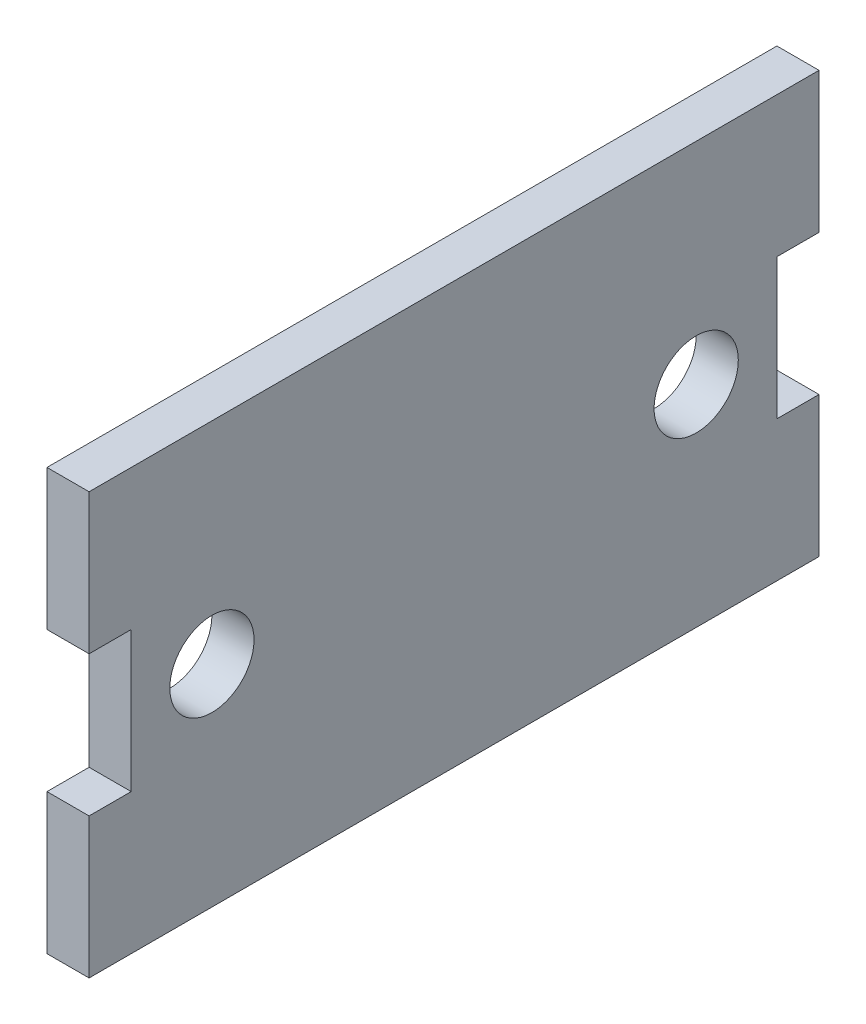
ISO-10303-21;
HEADER;
FILE_DESCRIPTION(('STEP AP214'),'2;1');
FILE_NAME('part.step','',(''),(''),'','','');
FILE_SCHEMA(('AUTOMOTIVE_DESIGN { 1 0 10303 214 1 1 1 1 }'));
ENDSEC;
DATA;
#1=APPLICATION_CONTEXT('core data for automotive mechanical design processes');
#2=APPLICATION_PROTOCOL_DEFINITION('international standard','automotive_design',2000,#1);
#3=PRODUCT_CONTEXT('',#1,'mechanical');
#4=PRODUCT('Part','Part','',(#3));
#5=PRODUCT_RELATED_PRODUCT_CATEGORY('part','',(#4));
#6=PRODUCT_DEFINITION_FORMATION('','',#4);
#7=PRODUCT_DEFINITION_CONTEXT('part definition',#1,'design');
#8=PRODUCT_DEFINITION('design','',#6,#7);
#9=PRODUCT_DEFINITION_SHAPE('','',#8);
#10=(LENGTH_UNIT() NAMED_UNIT(*) SI_UNIT(.MILLI.,.METRE.));
#11=(NAMED_UNIT(*) PLANE_ANGLE_UNIT() SI_UNIT($,.RADIAN.));
#12=(NAMED_UNIT(*) SI_UNIT($,.STERADIAN.) SOLID_ANGLE_UNIT());
#13=UNCERTAINTY_MEASURE_WITH_UNIT(LENGTH_MEASURE(1.E-05),#10,'distance_accuracy_value','');
#14=(GEOMETRIC_REPRESENTATION_CONTEXT(3) GLOBAL_UNCERTAINTY_ASSIGNED_CONTEXT((#13)) GLOBAL_UNIT_ASSIGNED_CONTEXT((#10,
#11,#12)) REPRESENTATION_CONTEXT('',''));
#15=CARTESIAN_POINT('',(0.,0.,0.));
#16=DIRECTION('',(0.,0.,1.));
#17=DIRECTION('',(1.,0.,0.));
#18=AXIS2_PLACEMENT_3D('',#15,#16,#17);
#19=CARTESIAN_POINT('',(1.5,5.,0.));
#20=DIRECTION('',(0.,0.,1.));
#21=DIRECTION('',(1.,0.,0.));
#22=AXIS2_PLACEMENT_3D('',#19,#20,#21);
#23=PLANE('',#22);
#24=DIRECTION('',(0.,1.,0.));
#25=VECTOR('',#24,1.);
#26=CARTESIAN_POINT('',(0.,5.,0.));
#27=LINE('',#26,#25);
#28=CARTESIAN_POINT('',(0.,0.,0.));
#29=VERTEX_POINT('',#28);
#30=CARTESIAN_POINT('',(0.,5.,0.));
#31=VERTEX_POINT('',#30);
#32=EDGE_CURVE('E163',#29,#31,#27,.T.);
#33=ORIENTED_EDGE('',*,*,#32,.T.);
#34=DIRECTION('',(-1.,0.,0.));
#35=VECTOR('',#34,1.);
#36=CARTESIAN_POINT('',(1.5,5.,0.));
#37=LINE('',#36,#35);
#38=CARTESIAN_POINT('',(1.5,5.,0.));
#39=VERTEX_POINT('',#38);
#40=EDGE_CURVE('E11',#39,#31,#37,.T.);
#41=ORIENTED_EDGE('',*,*,#40,.F.);
#42=DIRECTION('',(0.,1.,0.));
#43=VECTOR('',#42,1.);
#44=CARTESIAN_POINT('',(1.5,5.,0.));
#45=LINE('',#44,#43);
#46=CARTESIAN_POINT('',(1.5,0.,0.));
#47=VERTEX_POINT('',#46);
#48=EDGE_CURVE('E186',#47,#39,#45,.T.);
#49=ORIENTED_EDGE('',*,*,#48,.F.);
#50=DIRECTION('',(-1.,0.,0.));
#51=VECTOR('',#50,1.);
#52=CARTESIAN_POINT('',(1.5,0.,0.));
#53=LINE('',#52,#51);
#54=EDGE_CURVE('E159',#47,#29,#53,.T.);
#55=ORIENTED_EDGE('',*,*,#54,.T.);
#56=EDGE_LOOP('',(#33,#41,#49,#55));
#57=FACE_BOUND('',#56,.T.);
#58=ADVANCED_FACE('F43',(#57),#23,.F.);
#59=CARTESIAN_POINT('',(1.5,5.,1.5));
#60=DIRECTION('',(0.,-1.,0.));
#61=DIRECTION('',(0.,0.,-1.));
#62=AXIS2_PLACEMENT_3D('',#59,#60,#61);
#63=PLANE('',#62);
#64=DIRECTION('',(0.,0.,1.));
#65=VECTOR('',#64,1.);
#66=CARTESIAN_POINT('',(0.,5.,1.5));
#67=LINE('',#66,#65);
#68=CARTESIAN_POINT('',(0.,5.,1.5));
#69=VERTEX_POINT('',#68);
#70=EDGE_CURVE('E166',#31,#69,#67,.T.);
#71=ORIENTED_EDGE('',*,*,#70,.T.);
#72=DIRECTION('',(-1.,0.,0.));
#73=VECTOR('',#72,1.);
#74=CARTESIAN_POINT('',(1.5,5.,1.5));
#75=LINE('',#74,#73);
#76=CARTESIAN_POINT('',(1.5,5.,1.5));
#77=VERTEX_POINT('',#76);
#78=EDGE_CURVE('E51',#77,#69,#75,.T.);
#79=ORIENTED_EDGE('',*,*,#78,.F.);
#80=DIRECTION('',(0.,0.,1.));
#81=VECTOR('',#80,1.);
#82=CARTESIAN_POINT('',(1.5,5.,1.5));
#83=LINE('',#82,#81);
#84=EDGE_CURVE('E114',#39,#77,#83,.T.);
#85=ORIENTED_EDGE('',*,*,#84,.F.);
#86=ORIENTED_EDGE('',*,*,#40,.T.);
#87=EDGE_LOOP('',(#71,#79,#85,#86));
#88=FACE_BOUND('',#87,.T.);
#89=ADVANCED_FACE('F265',(#88),#63,.F.);
#90=CARTESIAN_POINT('',(1.5,10.,1.5));
#91=DIRECTION('',(0.,0.,1.));
#92=DIRECTION('',(0.,-1.,0.));
#93=AXIS2_PLACEMENT_3D('',#90,#91,#92);
#94=PLANE('',#93);
#95=DIRECTION('',(0.,1.,0.));
#96=VECTOR('',#95,1.);
#97=CARTESIAN_POINT('',(0.,10.,1.5));
#98=LINE('',#97,#96);
#99=CARTESIAN_POINT('',(0.,10.,1.5));
#100=VERTEX_POINT('',#99);
#101=EDGE_CURVE('E169',#69,#100,#98,.T.);
#102=ORIENTED_EDGE('',*,*,#101,.T.);
#103=DIRECTION('',(-1.,0.,0.));
#104=VECTOR('',#103,1.);
#105=CARTESIAN_POINT('',(1.5,10.,1.5));
#106=LINE('',#105,#104);
#107=CARTESIAN_POINT('',(1.5,10.,1.5));
#108=VERTEX_POINT('',#107);
#109=EDGE_CURVE('E205',#108,#100,#106,.T.);
#110=ORIENTED_EDGE('',*,*,#109,.F.);
#111=DIRECTION('',(0.,1.,0.));
#112=VECTOR('',#111,1.);
#113=CARTESIAN_POINT('',(1.5,10.,1.5));
#114=LINE('',#113,#112);
#115=EDGE_CURVE('E213',#77,#108,#114,.T.);
#116=ORIENTED_EDGE('',*,*,#115,.F.);
#117=ORIENTED_EDGE('',*,*,#78,.T.);
#118=EDGE_LOOP('',(#102,#110,#116,#117));
#119=FACE_BOUND('',#118,.T.);
#120=ADVANCED_FACE('F211',(#119),#94,.F.);
#121=CARTESIAN_POINT('',(1.5,10.,0.));
#122=DIRECTION('',(0.,1.,0.));
#123=DIRECTION('',(0.,0.,1.));
#124=AXIS2_PLACEMENT_3D('',#121,#122,#123);
#125=PLANE('',#124);
#126=DIRECTION('',(0.,0.,-1.));
#127=VECTOR('',#126,1.);
#128=CARTESIAN_POINT('',(0.,10.,0.));
#129=LINE('',#128,#127);
#130=CARTESIAN_POINT('',(0.,10.,0.));
#131=VERTEX_POINT('',#130);
#132=EDGE_CURVE('E171',#100,#131,#129,.T.);
#133=ORIENTED_EDGE('',*,*,#132,.T.);
#134=DIRECTION('',(-1.,0.,0.));
#135=VECTOR('',#134,1.);
#136=CARTESIAN_POINT('',(1.5,10.,0.));
#137=LINE('',#136,#135);
#138=CARTESIAN_POINT('',(1.5,10.,0.));
#139=VERTEX_POINT('',#138);
#140=EDGE_CURVE('E202',#139,#131,#137,.T.);
#141=ORIENTED_EDGE('',*,*,#140,.F.);
#142=DIRECTION('',(0.,0.,-1.));
#143=VECTOR('',#142,1.);
#144=CARTESIAN_POINT('',(1.5,10.,0.));
#145=LINE('',#144,#143);
#146=EDGE_CURVE('E231',#108,#139,#145,.T.);
#147=ORIENTED_EDGE('',*,*,#146,.F.);
#148=ORIENTED_EDGE('',*,*,#109,.T.);
#149=EDGE_LOOP('',(#133,#141,#147,#148));
#150=FACE_BOUND('',#149,.T.);
#151=ADVANCED_FACE('F222',(#150),#125,.F.);
#152=CARTESIAN_POINT('',(1.5,15.,0.));
#153=DIRECTION('',(0.,0.,1.));
#154=DIRECTION('',(0.,-1.,0.));
#155=AXIS2_PLACEMENT_3D('',#152,#153,#154);
#156=PLANE('',#155);
#157=DIRECTION('',(0.,1.,0.));
#158=VECTOR('',#157,1.);
#159=CARTESIAN_POINT('',(0.,15.,0.));
#160=LINE('',#159,#158);
#161=CARTESIAN_POINT('',(0.,15.,0.));
#162=VERTEX_POINT('',#161);
#163=EDGE_CURVE('E173',#131,#162,#160,.T.);
#164=ORIENTED_EDGE('',*,*,#163,.T.);
#165=DIRECTION('',(-1.,0.,0.));
#166=VECTOR('',#165,1.);
#167=CARTESIAN_POINT('',(1.5,15.,0.));
#168=LINE('',#167,#166);
#169=CARTESIAN_POINT('',(1.5,15.,0.));
#170=VERTEX_POINT('',#169);
#171=EDGE_CURVE('E199',#170,#162,#168,.T.);
#172=ORIENTED_EDGE('',*,*,#171,.F.);
#173=DIRECTION('',(0.,1.,0.));
#174=VECTOR('',#173,1.);
#175=CARTESIAN_POINT('',(1.5,15.,0.));
#176=LINE('',#175,#174);
#177=EDGE_CURVE('E228',#139,#170,#176,.T.);
#178=ORIENTED_EDGE('',*,*,#177,.F.);
#179=ORIENTED_EDGE('',*,*,#140,.T.);
#180=EDGE_LOOP('',(#164,#172,#178,#179));
#181=FACE_BOUND('',#180,.T.);
#182=ADVANCED_FACE('F226',(#181),#156,.F.);
#183=CARTESIAN_POINT('',(1.5,15.,26.));
#184=DIRECTION('',(0.,-1.,0.));
#185=DIRECTION('',(0.,0.,-1.));
#186=AXIS2_PLACEMENT_3D('',#183,#184,#185);
#187=PLANE('',#186);
#188=DIRECTION('',(0.,0.,1.));
#189=VECTOR('',#188,1.);
#190=CARTESIAN_POINT('',(0.,15.,26.));
#191=LINE('',#190,#189);
#192=CARTESIAN_POINT('',(0.,15.,26.));
#193=VERTEX_POINT('',#192);
#194=EDGE_CURVE('E175',#162,#193,#191,.T.);
#195=ORIENTED_EDGE('',*,*,#194,.T.);
#196=DIRECTION('',(-1.,0.,0.));
#197=VECTOR('',#196,1.);
#198=CARTESIAN_POINT('',(1.5,15.,26.));
#199=LINE('',#198,#197);
#200=CARTESIAN_POINT('',(1.5,15.,26.));
#201=VERTEX_POINT('',#200);
#202=EDGE_CURVE('E196',#201,#193,#199,.T.);
#203=ORIENTED_EDGE('',*,*,#202,.F.);
#204=DIRECTION('',(0.,0.,1.));
#205=VECTOR('',#204,1.);
#206=CARTESIAN_POINT('',(1.5,15.,26.));
#207=LINE('',#206,#205);
#208=EDGE_CURVE('E230',#170,#201,#207,.T.);
#209=ORIENTED_EDGE('',*,*,#208,.F.);
#210=ORIENTED_EDGE('',*,*,#171,.T.);
#211=EDGE_LOOP('',(#195,#203,#209,#210));
#212=FACE_BOUND('',#211,.T.);
#213=ADVANCED_FACE('F278',(#212),#187,.F.);
#214=CARTESIAN_POINT('',(1.5,10.,26.));
#215=DIRECTION('',(0.,0.,-1.));
#216=DIRECTION('',(-1.,0.,0.));
#217=AXIS2_PLACEMENT_3D('',#214,#215,#216);
#218=PLANE('',#217);
#219=DIRECTION('',(0.,-1.,0.));
#220=VECTOR('',#219,1.);
#221=CARTESIAN_POINT('',(0.,10.,26.));
#222=LINE('',#221,#220);
#223=CARTESIAN_POINT('',(0.,10.,26.));
#224=VERTEX_POINT('',#223);
#225=EDGE_CURVE('E177',#193,#224,#222,.T.);
#226=ORIENTED_EDGE('',*,*,#225,.T.);
#227=DIRECTION('',(-1.,0.,0.));
#228=VECTOR('',#227,1.);
#229=CARTESIAN_POINT('',(1.5,10.,26.));
#230=LINE('',#229,#228);
#231=CARTESIAN_POINT('',(1.5,10.,26.));
#232=VERTEX_POINT('',#231);
#233=EDGE_CURVE('E193',#232,#224,#230,.T.);
#234=ORIENTED_EDGE('',*,*,#233,.F.);
#235=DIRECTION('',(0.,-1.,0.));
#236=VECTOR('',#235,1.);
#237=CARTESIAN_POINT('',(1.5,10.,26.));
#238=LINE('',#237,#236);
#239=EDGE_CURVE('E233',#201,#232,#238,.T.);
#240=ORIENTED_EDGE('',*,*,#239,.F.);
#241=ORIENTED_EDGE('',*,*,#202,.T.);
#242=EDGE_LOOP('',(#226,#234,#240,#241));
#243=FACE_BOUND('',#242,.T.);
#244=ADVANCED_FACE('F281',(#243),#218,.F.);
#245=CARTESIAN_POINT('',(1.5,10.,24.5));
#246=DIRECTION('',(0.,1.,0.));
#247=DIRECTION('',(0.,0.,1.));
#248=AXIS2_PLACEMENT_3D('',#245,#246,#247);
#249=PLANE('',#248);
#250=DIRECTION('',(0.,0.,-1.));
#251=VECTOR('',#250,1.);
#252=CARTESIAN_POINT('',(0.,10.,24.5));
#253=LINE('',#252,#251);
#254=CARTESIAN_POINT('',(0.,10.,24.5));
#255=VERTEX_POINT('',#254);
#256=EDGE_CURVE('E179',#224,#255,#253,.T.);
#257=ORIENTED_EDGE('',*,*,#256,.T.);
#258=DIRECTION('',(-1.,0.,0.));
#259=VECTOR('',#258,1.);
#260=CARTESIAN_POINT('',(1.5,10.,24.5));
#261=LINE('',#260,#259);
#262=CARTESIAN_POINT('',(1.5,10.,24.5));
#263=VERTEX_POINT('',#262);
#264=EDGE_CURVE('E190',#263,#255,#261,.T.);
#265=ORIENTED_EDGE('',*,*,#264,.F.);
#266=DIRECTION('',(0.,0.,-1.));
#267=VECTOR('',#266,1.);
#268=CARTESIAN_POINT('',(1.5,10.,24.5));
#269=LINE('',#268,#267);
#270=EDGE_CURVE('E239',#232,#263,#269,.T.);
#271=ORIENTED_EDGE('',*,*,#270,.F.);
#272=ORIENTED_EDGE('',*,*,#233,.T.);
#273=EDGE_LOOP('',(#257,#265,#271,#272));
#274=FACE_BOUND('',#273,.T.);
#275=ADVANCED_FACE('F245',(#274),#249,.F.);
#276=CARTESIAN_POINT('',(1.5,5.,24.5));
#277=DIRECTION('',(0.,0.,-1.));
#278=DIRECTION('',(-1.,0.,0.));
#279=AXIS2_PLACEMENT_3D('',#276,#277,#278);
#280=PLANE('',#279);
#281=DIRECTION('',(0.,-1.,0.));
#282=VECTOR('',#281,1.);
#283=CARTESIAN_POINT('',(0.,5.,24.5));
#284=LINE('',#283,#282);
#285=CARTESIAN_POINT('',(0.,5.,24.5));
#286=VERTEX_POINT('',#285);
#287=EDGE_CURVE('E181',#255,#286,#284,.T.);
#288=ORIENTED_EDGE('',*,*,#287,.T.);
#289=DIRECTION('',(-1.,0.,0.));
#290=VECTOR('',#289,1.);
#291=CARTESIAN_POINT('',(1.5,5.,24.5));
#292=LINE('',#291,#290);
#293=CARTESIAN_POINT('',(1.5,5.,24.5));
#294=VERTEX_POINT('',#293);
#295=EDGE_CURVE('E154',#294,#286,#292,.T.);
#296=ORIENTED_EDGE('',*,*,#295,.F.);
#297=DIRECTION('',(0.,-1.,0.));
#298=VECTOR('',#297,1.);
#299=CARTESIAN_POINT('',(1.5,5.,24.5));
#300=LINE('',#299,#298);
#301=EDGE_CURVE('E145',#263,#294,#300,.T.);
#302=ORIENTED_EDGE('',*,*,#301,.F.);
#303=ORIENTED_EDGE('',*,*,#264,.T.);
#304=EDGE_LOOP('',(#288,#296,#302,#303));
#305=FACE_BOUND('',#304,.T.);
#306=ADVANCED_FACE('F249',(#305),#280,.F.);
#307=CARTESIAN_POINT('',(1.5,5.,26.));
#308=DIRECTION('',(0.,-1.,0.));
#309=DIRECTION('',(0.,0.,-1.));
#310=AXIS2_PLACEMENT_3D('',#307,#308,#309);
#311=PLANE('',#310);
#312=DIRECTION('',(0.,0.,1.));
#313=VECTOR('',#312,1.);
#314=CARTESIAN_POINT('',(0.,5.,26.));
#315=LINE('',#314,#313);
#316=CARTESIAN_POINT('',(0.,5.,26.));
#317=VERTEX_POINT('',#316);
#318=EDGE_CURVE('E153',#286,#317,#315,.T.);
#319=ORIENTED_EDGE('',*,*,#318,.T.);
#320=DIRECTION('',(-1.,0.,0.));
#321=VECTOR('',#320,1.);
#322=CARTESIAN_POINT('',(1.5,5.,26.));
#323=LINE('',#322,#321);
#324=CARTESIAN_POINT('',(1.5,5.,26.));
#325=VERTEX_POINT('',#324);
#326=EDGE_CURVE('E150',#325,#317,#323,.T.);
#327=ORIENTED_EDGE('',*,*,#326,.F.);
#328=DIRECTION('',(0.,0.,1.));
#329=VECTOR('',#328,1.);
#330=CARTESIAN_POINT('',(1.5,5.,26.));
#331=LINE('',#330,#329);
#332=EDGE_CURVE('E139',#294,#325,#331,.T.);
#333=ORIENTED_EDGE('',*,*,#332,.F.);
#334=ORIENTED_EDGE('',*,*,#295,.T.);
#335=EDGE_LOOP('',(#319,#327,#333,#334));
#336=FACE_BOUND('',#335,.T.);
#337=ADVANCED_FACE('F151',(#336),#311,.F.);
#338=CARTESIAN_POINT('',(1.5,0.,26.));
#339=DIRECTION('',(0.,0.,-1.));
#340=DIRECTION('',(-1.,0.,0.));
#341=AXIS2_PLACEMENT_3D('',#338,#339,#340);
#342=PLANE('',#341);
#343=DIRECTION('',(0.,-1.,0.));
#344=VECTOR('',#343,1.);
#345=CARTESIAN_POINT('',(0.,0.,26.));
#346=LINE('',#345,#344);
#347=CARTESIAN_POINT('',(0.,0.,26.));
#348=VERTEX_POINT('',#347);
#349=EDGE_CURVE('E100',#317,#348,#346,.T.);
#350=ORIENTED_EDGE('',*,*,#349,.T.);
#351=DIRECTION('',(-1.,0.,0.));
#352=VECTOR('',#351,1.);
#353=CARTESIAN_POINT('',(1.5,0.,26.));
#354=LINE('',#353,#352);
#355=CARTESIAN_POINT('',(1.5,0.,26.));
#356=VERTEX_POINT('',#355);
#357=EDGE_CURVE('E155',#356,#348,#354,.T.);
#358=ORIENTED_EDGE('',*,*,#357,.F.);
#359=DIRECTION('',(0.,-1.,0.));
#360=VECTOR('',#359,1.);
#361=CARTESIAN_POINT('',(1.5,0.,26.));
#362=LINE('',#361,#360);
#363=EDGE_CURVE('E143',#325,#356,#362,.T.);
#364=ORIENTED_EDGE('',*,*,#363,.F.);
#365=ORIENTED_EDGE('',*,*,#326,.T.);
#366=EDGE_LOOP('',(#350,#358,#364,#365));
#367=FACE_BOUND('',#366,.T.);
#368=ADVANCED_FACE('F157',(#367),#342,.F.);
#369=CARTESIAN_POINT('',(1.5,0.,0.));
#370=DIRECTION('',(0.,1.,0.));
#371=DIRECTION('',(0.,0.,1.));
#372=AXIS2_PLACEMENT_3D('',#369,#370,#371);
#373=PLANE('',#372);
#374=DIRECTION('',(0.,0.,-1.));
#375=VECTOR('',#374,1.);
#376=CARTESIAN_POINT('',(0.,0.,0.));
#377=LINE('',#376,#375);
#378=EDGE_CURVE('E106',#348,#29,#377,.T.);
#379=ORIENTED_EDGE('',*,*,#378,.T.);
#380=ORIENTED_EDGE('',*,*,#54,.F.);
#381=DIRECTION('',(0.,0.,-1.));
#382=VECTOR('',#381,1.);
#383=CARTESIAN_POINT('',(1.5,0.,0.));
#384=LINE('',#383,#382);
#385=EDGE_CURVE('E59',#356,#47,#384,.T.);
#386=ORIENTED_EDGE('',*,*,#385,.F.);
#387=ORIENTED_EDGE('',*,*,#357,.T.);
#388=EDGE_LOOP('',(#379,#380,#386,#387));
#389=FACE_BOUND('',#388,.T.);
#390=ADVANCED_FACE('F253',(#389),#373,.F.);
#391=CARTESIAN_POINT('',(1.5,0.,0.));
#392=DIRECTION('',(-1.,0.,0.));
#393=DIRECTION('',(0.,0.,1.));
#394=AXIS2_PLACEMENT_3D('',#391,#392,#393);
#395=PLANE('',#394);
#396=CARTESIAN_POINT('',(1.5,7.5,21.625));
#397=DIRECTION('',(1.,0.,0.));
#398=DIRECTION('',(0.,0.,-1.));
#399=AXIS2_PLACEMENT_3D('',#396,#397,#398);
#400=CIRCLE('',#399,1.5);
#401=CARTESIAN_POINT('',(1.5,7.5,20.125));
#402=VERTEX_POINT('',#401);
#403=EDGE_CURVE('E452',#402,#402,#400,.T.);
#404=ORIENTED_EDGE('',*,*,#403,.F.);
#405=EDGE_LOOP('',(#404));
#406=FACE_BOUND('',#405,.T.);
#407=CARTESIAN_POINT('',(1.5,7.5,4.375));
#408=DIRECTION('',(1.,0.,0.));
#409=DIRECTION('',(0.,0.,-1.));
#410=AXIS2_PLACEMENT_3D('',#407,#408,#409);
#411=CIRCLE('',#410,1.5);
#412=CARTESIAN_POINT('',(1.5,7.5,2.875));
#413=VERTEX_POINT('',#412);
#414=EDGE_CURVE('E453',#413,#413,#411,.T.);
#415=ORIENTED_EDGE('',*,*,#414,.F.);
#416=EDGE_LOOP('',(#415));
#417=FACE_BOUND('',#416,.T.);
#418=ORIENTED_EDGE('',*,*,#48,.T.);
#419=ORIENTED_EDGE('',*,*,#84,.T.);
#420=ORIENTED_EDGE('',*,*,#115,.T.);
#421=ORIENTED_EDGE('',*,*,#146,.T.);
#422=ORIENTED_EDGE('',*,*,#177,.T.);
#423=ORIENTED_EDGE('',*,*,#208,.T.);
#424=ORIENTED_EDGE('',*,*,#239,.T.);
#425=ORIENTED_EDGE('',*,*,#270,.T.);
#426=ORIENTED_EDGE('',*,*,#301,.T.);
#427=ORIENTED_EDGE('',*,*,#332,.T.);
#428=ORIENTED_EDGE('',*,*,#363,.T.);
#429=ORIENTED_EDGE('',*,*,#385,.T.);
#430=EDGE_LOOP('',(#418,#419,#420,#421,#422,#423,#424,#425,#426,#427,#428,#429));
#431=FACE_BOUND('',#430,.T.);
#432=ADVANCED_FACE('F141',(#406,#417,#431),#395,.F.);
#433=CARTESIAN_POINT('',(0.,0.,0.));
#434=DIRECTION('',(-1.,0.,0.));
#435=DIRECTION('',(0.,0.,1.));
#436=AXIS2_PLACEMENT_3D('',#433,#434,#435);
#437=PLANE('',#436);
#438=CARTESIAN_POINT('',(0.,7.5,21.625));
#439=DIRECTION('',(1.,0.,0.));
#440=DIRECTION('',(0.,0.,-1.));
#441=AXIS2_PLACEMENT_3D('',#438,#439,#440);
#442=CIRCLE('',#441,1.5);
#443=CARTESIAN_POINT('',(0.,7.5,20.125));
#444=VERTEX_POINT('',#443);
#445=EDGE_CURVE('E167',#444,#444,#442,.T.);
#446=ORIENTED_EDGE('',*,*,#445,.T.);
#447=EDGE_LOOP('',(#446));
#448=FACE_BOUND('',#447,.T.);
#449=CARTESIAN_POINT('',(0.,7.5,4.375));
#450=DIRECTION('',(1.,0.,0.));
#451=DIRECTION('',(0.,0.,-1.));
#452=AXIS2_PLACEMENT_3D('',#449,#450,#451);
#453=CIRCLE('',#452,1.5);
#454=CARTESIAN_POINT('',(0.,7.5,2.875));
#455=VERTEX_POINT('',#454);
#456=EDGE_CURVE('E457',#455,#455,#453,.T.);
#457=ORIENTED_EDGE('',*,*,#456,.T.);
#458=EDGE_LOOP('',(#457));
#459=FACE_BOUND('',#458,.T.);
#460=ORIENTED_EDGE('',*,*,#32,.F.);
#461=ORIENTED_EDGE('',*,*,#378,.F.);
#462=ORIENTED_EDGE('',*,*,#349,.F.);
#463=ORIENTED_EDGE('',*,*,#318,.F.);
#464=ORIENTED_EDGE('',*,*,#287,.F.);
#465=ORIENTED_EDGE('',*,*,#256,.F.);
#466=ORIENTED_EDGE('',*,*,#225,.F.);
#467=ORIENTED_EDGE('',*,*,#194,.F.);
#468=ORIENTED_EDGE('',*,*,#163,.F.);
#469=ORIENTED_EDGE('',*,*,#132,.F.);
#470=ORIENTED_EDGE('',*,*,#101,.F.);
#471=ORIENTED_EDGE('',*,*,#70,.F.);
#472=EDGE_LOOP('',(#460,#461,#462,#463,#464,#465,#466,#467,#468,#469,#470,#471));
#473=FACE_BOUND('',#472,.T.);
#474=ADVANCED_FACE('F217',(#448,#459,#473),#437,.T.);
#475=CARTESIAN_POINT('',(0.,7.5,4.375));
#476=DIRECTION('',(1.,0.,0.));
#477=DIRECTION('',(0.,0.,-1.));
#478=AXIS2_PLACEMENT_3D('',#475,#476,#477);
#479=CYLINDRICAL_SURFACE('',#478,1.5);
#480=ORIENTED_EDGE('',*,*,#456,.F.);
#481=EDGE_LOOP('',(#480));
#482=FACE_BOUND('',#481,.T.);
#483=ORIENTED_EDGE('',*,*,#414,.T.);
#484=EDGE_LOOP('',(#483));
#485=FACE_BOUND('',#484,.T.);
#486=ADVANCED_FACE('F317',(#482,#485),#479,.F.);
#487=CARTESIAN_POINT('',(0.,7.5,21.625));
#488=DIRECTION('',(1.,0.,0.));
#489=DIRECTION('',(0.,0.,-1.));
#490=AXIS2_PLACEMENT_3D('',#487,#488,#489);
#491=CYLINDRICAL_SURFACE('',#490,1.5);
#492=ORIENTED_EDGE('',*,*,#445,.F.);
#493=EDGE_LOOP('',(#492));
#494=FACE_BOUND('',#493,.T.);
#495=ORIENTED_EDGE('',*,*,#403,.T.);
#496=EDGE_LOOP('',(#495));
#497=FACE_BOUND('',#496,.T.);
#498=ADVANCED_FACE('F329',(#494,#497),#491,.F.);
#499=CLOSED_SHELL('',(#58,#89,#120,#151,#182,#213,#244,#275,#306,#337,#368,#390,#432,#474,#486,#498));
#500=MANIFOLD_SOLID_BREP('B2',#499);
#501=ADVANCED_BREP_SHAPE_REPRESENTATION('',(#18,#500),#14);
#502=SHAPE_DEFINITION_REPRESENTATION(#9,#501);
ENDSEC;
END-ISO-10303-21;
